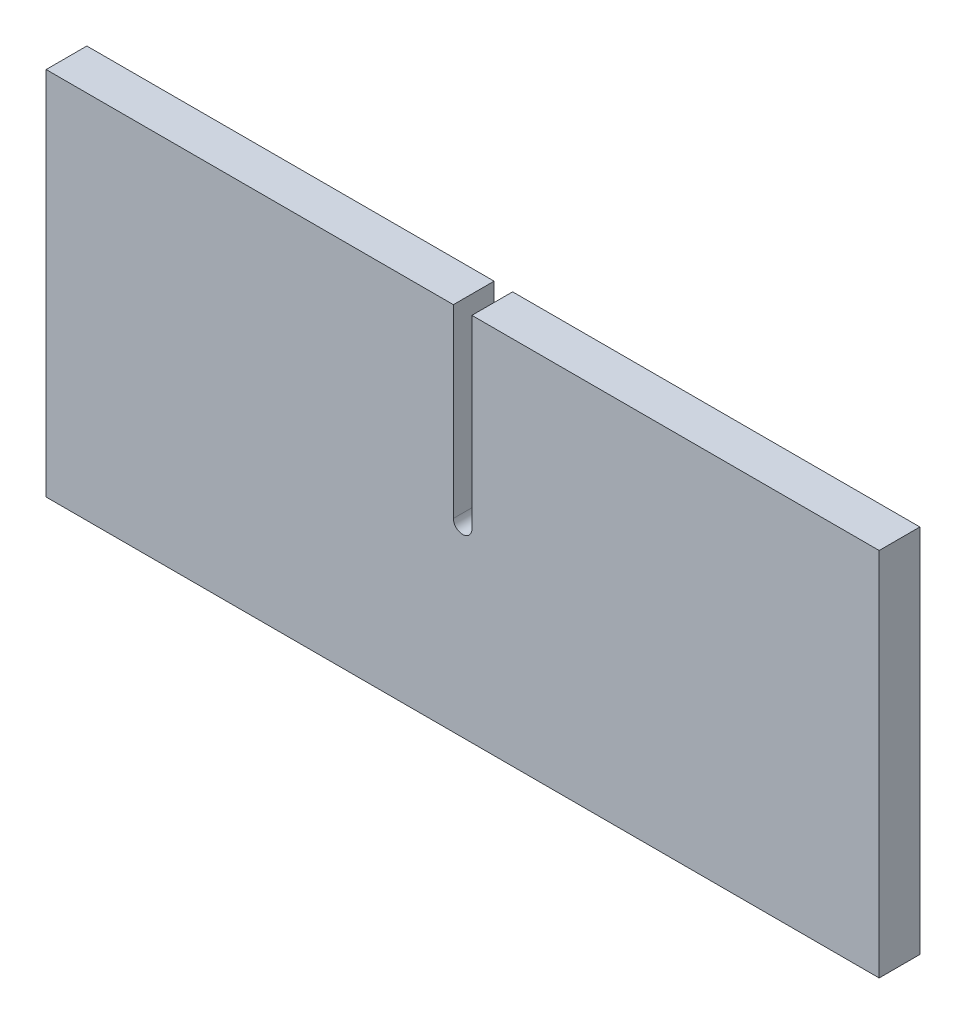
ISO-10303-21;
HEADER;
FILE_DESCRIPTION(('STEP AP214'),'2;1');
FILE_NAME('part.step','',(''),(''),'','','');
FILE_SCHEMA(('AUTOMOTIVE_DESIGN { 1 0 10303 214 1 1 1 1 }'));
ENDSEC;
DATA;
#1=APPLICATION_CONTEXT('core data for automotive mechanical design processes');
#2=APPLICATION_PROTOCOL_DEFINITION('international standard','automotive_design',2000,#1);
#3=PRODUCT_CONTEXT('',#1,'mechanical');
#4=PRODUCT('Part','Part','',(#3));
#5=PRODUCT_RELATED_PRODUCT_CATEGORY('part','',(#4));
#6=PRODUCT_DEFINITION_FORMATION('','',#4);
#7=PRODUCT_DEFINITION_CONTEXT('part definition',#1,'design');
#8=PRODUCT_DEFINITION('design','',#6,#7);
#9=PRODUCT_DEFINITION_SHAPE('','',#8);
#10=(LENGTH_UNIT() NAMED_UNIT(*) SI_UNIT(.MILLI.,.METRE.));
#11=(NAMED_UNIT(*) PLANE_ANGLE_UNIT() SI_UNIT($,.RADIAN.));
#12=(NAMED_UNIT(*) SI_UNIT($,.STERADIAN.) SOLID_ANGLE_UNIT());
#13=UNCERTAINTY_MEASURE_WITH_UNIT(LENGTH_MEASURE(1.E-05),#10,'distance_accuracy_value','');
#14=(GEOMETRIC_REPRESENTATION_CONTEXT(3) GLOBAL_UNCERTAINTY_ASSIGNED_CONTEXT((#13)) GLOBAL_UNIT_ASSIGNED_CONTEXT((#10,
#11,#12)) REPRESENTATION_CONTEXT('',''));
#15=CARTESIAN_POINT('',(0.,0.,0.));
#16=DIRECTION('',(0.,0.,1.));
#17=DIRECTION('',(1.,0.,0.));
#18=AXIS2_PLACEMENT_3D('',#15,#16,#17);
#19=CARTESIAN_POINT('',(-225.,-100.,22.));
#20=DIRECTION('',(1.,0.,0.));
#21=DIRECTION('',(0.,0.,-1.));
#22=AXIS2_PLACEMENT_3D('',#19,#20,#21);
#23=PLANE('',#22);
#24=DIRECTION('',(0.,-1.,0.));
#25=VECTOR('',#24,1.);
#26=CARTESIAN_POINT('',(-225.,-100.,0.));
#27=LINE('',#26,#25);
#28=CARTESIAN_POINT('',(-225.,100.,0.));
#29=VERTEX_POINT('',#28);
#30=CARTESIAN_POINT('',(-225.,-100.,0.));
#31=VERTEX_POINT('',#30);
#32=EDGE_CURVE('E128',#29,#31,#27,.T.);
#33=ORIENTED_EDGE('',*,*,#32,.T.);
#34=DIRECTION('',(0.,0.,-1.));
#35=VECTOR('',#34,1.);
#36=CARTESIAN_POINT('',(-225.,-100.,22.));
#37=LINE('',#36,#35);
#38=CARTESIAN_POINT('',(-225.,-100.,22.));
#39=VERTEX_POINT('',#38);
#40=EDGE_CURVE('E11',#39,#31,#37,.T.);
#41=ORIENTED_EDGE('',*,*,#40,.F.);
#42=DIRECTION('',(0.,-1.,0.));
#43=VECTOR('',#42,1.);
#44=CARTESIAN_POINT('',(-225.,-100.,22.));
#45=LINE('',#44,#43);
#46=CARTESIAN_POINT('',(-225.,100.,22.));
#47=VERTEX_POINT('',#46);
#48=EDGE_CURVE('E142',#47,#39,#45,.T.);
#49=ORIENTED_EDGE('',*,*,#48,.F.);
#50=DIRECTION('',(0.,0.,-1.));
#51=VECTOR('',#50,1.);
#52=CARTESIAN_POINT('',(-225.,100.,22.));
#53=LINE('',#52,#51);
#54=EDGE_CURVE('E124',#47,#29,#53,.T.);
#55=ORIENTED_EDGE('',*,*,#54,.T.);
#56=EDGE_LOOP('',(#33,#41,#49,#55));
#57=FACE_BOUND('',#56,.T.);
#58=ADVANCED_FACE('F32',(#57),#23,.F.);
#59=CARTESIAN_POINT('',(225.,-100.,22.));
#60=DIRECTION('',(0.,1.,0.));
#61=DIRECTION('',(-1.,0.,0.));
#62=AXIS2_PLACEMENT_3D('',#59,#60,#61);
#63=PLANE('',#62);
#64=DIRECTION('',(1.,0.,0.));
#65=VECTOR('',#64,1.);
#66=CARTESIAN_POINT('',(225.,-100.,0.));
#67=LINE('',#66,#65);
#68=CARTESIAN_POINT('',(225.,-100.,0.));
#69=VERTEX_POINT('',#68);
#70=EDGE_CURVE('E131',#31,#69,#67,.T.);
#71=ORIENTED_EDGE('',*,*,#70,.T.);
#72=DIRECTION('',(0.,0.,-1.));
#73=VECTOR('',#72,1.);
#74=CARTESIAN_POINT('',(225.,-100.,22.));
#75=LINE('',#74,#73);
#76=CARTESIAN_POINT('',(225.,-100.,22.));
#77=VERTEX_POINT('',#76);
#78=EDGE_CURVE('E40',#77,#69,#75,.T.);
#79=ORIENTED_EDGE('',*,*,#78,.F.);
#80=DIRECTION('',(1.,0.,0.));
#81=VECTOR('',#80,1.);
#82=CARTESIAN_POINT('',(225.,-100.,22.));
#83=LINE('',#82,#81);
#84=EDGE_CURVE('E91',#39,#77,#83,.T.);
#85=ORIENTED_EDGE('',*,*,#84,.F.);
#86=ORIENTED_EDGE('',*,*,#40,.T.);
#87=EDGE_LOOP('',(#71,#79,#85,#86));
#88=FACE_BOUND('',#87,.T.);
#89=ADVANCED_FACE('F177',(#88),#63,.F.);
#90=CARTESIAN_POINT('',(225.,-100.,22.));
#91=DIRECTION('',(-1.,0.,0.));
#92=DIRECTION('',(0.,0.,1.));
#93=AXIS2_PLACEMENT_3D('',#90,#91,#92);
#94=PLANE('',#93);
#95=DIRECTION('',(0.,1.,0.));
#96=VECTOR('',#95,1.);
#97=CARTESIAN_POINT('',(225.,-100.,0.));
#98=LINE('',#97,#96);
#99=CARTESIAN_POINT('',(225.,100.,0.));
#100=VERTEX_POINT('',#99);
#101=EDGE_CURVE('E133',#69,#100,#98,.T.);
#102=ORIENTED_EDGE('',*,*,#101,.T.);
#103=DIRECTION('',(0.,0.,-1.));
#104=VECTOR('',#103,1.);
#105=CARTESIAN_POINT('',(225.,100.,22.));
#106=LINE('',#105,#104);
#107=CARTESIAN_POINT('',(225.,100.,22.));
#108=VERTEX_POINT('',#107);
#109=EDGE_CURVE('E149',#108,#100,#106,.T.);
#110=ORIENTED_EDGE('',*,*,#109,.F.);
#111=DIRECTION('',(0.,1.,0.));
#112=VECTOR('',#111,1.);
#113=CARTESIAN_POINT('',(225.,-100.,22.));
#114=LINE('',#113,#112);
#115=EDGE_CURVE('E157',#77,#108,#114,.T.);
#116=ORIENTED_EDGE('',*,*,#115,.F.);
#117=ORIENTED_EDGE('',*,*,#78,.T.);
#118=EDGE_LOOP('',(#102,#110,#116,#117));
#119=FACE_BOUND('',#118,.T.);
#120=ADVANCED_FACE('F155',(#119),#94,.F.);
#121=CARTESIAN_POINT('',(225.,100.,22.));
#122=DIRECTION('',(0.,-1.,0.));
#123=DIRECTION('',(1.,0.,0.));
#124=AXIS2_PLACEMENT_3D('',#121,#122,#123);
#125=PLANE('',#124);
#126=DIRECTION('',(-1.,0.,0.));
#127=VECTOR('',#126,1.);
#128=CARTESIAN_POINT('',(225.,100.,0.));
#129=LINE('',#128,#127);
#130=CARTESIAN_POINT('',(5.00000000000006,100.,0.));
#131=VERTEX_POINT('',#130);
#132=EDGE_CURVE('E135',#100,#131,#129,.T.);
#133=ORIENTED_EDGE('',*,*,#132,.T.);
#134=DIRECTION('',(0.,0.,-1.));
#135=VECTOR('',#134,1.);
#136=CARTESIAN_POINT('',(5.00000000000006,100.,22.));
#137=LINE('',#136,#135);
#138=CARTESIAN_POINT('',(5.00000000000006,100.,22.));
#139=VERTEX_POINT('',#138);
#140=EDGE_CURVE('E146',#139,#131,#137,.T.);
#141=ORIENTED_EDGE('',*,*,#140,.F.);
#142=DIRECTION('',(-1.,0.,0.));
#143=VECTOR('',#142,1.);
#144=CARTESIAN_POINT('',(225.,100.,22.));
#145=LINE('',#144,#143);
#146=EDGE_CURVE('E169',#108,#139,#145,.T.);
#147=ORIENTED_EDGE('',*,*,#146,.F.);
#148=ORIENTED_EDGE('',*,*,#109,.T.);
#149=EDGE_LOOP('',(#133,#141,#147,#148));
#150=FACE_BOUND('',#149,.T.);
#151=ADVANCED_FACE('F165',(#150),#125,.F.);
#152=CARTESIAN_POINT('',(5.00000000000006,100.,22.));
#153=DIRECTION('',(1.,0.,0.));
#154=DIRECTION('',(0.,0.,-1.));
#155=AXIS2_PLACEMENT_3D('',#152,#153,#154);
#156=PLANE('',#155);
#157=DIRECTION('',(0.,-1.,0.));
#158=VECTOR('',#157,1.);
#159=CARTESIAN_POINT('',(5.00000000000006,100.,0.));
#160=LINE('',#159,#158);
#161=CARTESIAN_POINT('',(5.00000000000006,0.,0.));
#162=VERTEX_POINT('',#161);
#163=EDGE_CURVE('E137',#131,#162,#160,.T.);
#164=ORIENTED_EDGE('',*,*,#163,.T.);
#165=DIRECTION('',(0.,0.,-1.));
#166=VECTOR('',#165,1.);
#167=CARTESIAN_POINT('',(5.00000000000006,0.,22.));
#168=LINE('',#167,#166);
#169=CARTESIAN_POINT('',(5.00000000000006,0.,22.));
#170=VERTEX_POINT('',#169);
#171=EDGE_CURVE('E119',#170,#162,#168,.T.);
#172=ORIENTED_EDGE('',*,*,#171,.F.);
#173=DIRECTION('',(0.,-1.,0.));
#174=VECTOR('',#173,1.);
#175=CARTESIAN_POINT('',(5.00000000000006,100.,22.));
#176=LINE('',#175,#174);
#177=EDGE_CURVE('E110',#139,#170,#176,.T.);
#178=ORIENTED_EDGE('',*,*,#177,.F.);
#179=ORIENTED_EDGE('',*,*,#140,.T.);
#180=EDGE_LOOP('',(#164,#172,#178,#179));
#181=FACE_BOUND('',#180,.T.);
#182=ADVANCED_FACE('F168',(#181),#156,.F.);
#183=CARTESIAN_POINT('',(0.,0.,22.));
#184=DIRECTION('',(0.,0.,-1.));
#185=DIRECTION('',(-1.,0.,0.));
#186=AXIS2_PLACEMENT_3D('',#183,#184,#185);
#187=CYLINDRICAL_SURFACE('',#186,5.);
#188=CARTESIAN_POINT('',(0.,0.,0.));
#189=DIRECTION('',(0.,0.,-1.));
#190=DIRECTION('',(1.,0.,0.));
#191=AXIS2_PLACEMENT_3D('',#188,#189,#190);
#192=CIRCLE('',#191,5.);
#193=CARTESIAN_POINT('',(-4.99999999999995,0.,0.));
#194=VERTEX_POINT('',#193);
#195=EDGE_CURVE('E118',#162,#194,#192,.T.);
#196=ORIENTED_EDGE('',*,*,#195,.T.);
#197=DIRECTION('',(0.,0.,-1.));
#198=VECTOR('',#197,1.);
#199=CARTESIAN_POINT('',(-4.99999999999995,0.,22.));
#200=LINE('',#199,#198);
#201=CARTESIAN_POINT('',(-4.99999999999995,0.,22.));
#202=VERTEX_POINT('',#201);
#203=EDGE_CURVE('E115',#202,#194,#200,.T.);
#204=ORIENTED_EDGE('',*,*,#203,.F.);
#205=CARTESIAN_POINT('',(0.,0.,22.));
#206=DIRECTION('',(0.,0.,-1.));
#207=DIRECTION('',(1.,0.,0.));
#208=AXIS2_PLACEMENT_3D('',#205,#206,#207);
#209=CIRCLE('',#208,5.);
#210=EDGE_CURVE('E104',#170,#202,#209,.T.);
#211=ORIENTED_EDGE('',*,*,#210,.F.);
#212=ORIENTED_EDGE('',*,*,#171,.T.);
#213=EDGE_LOOP('',(#196,#204,#211,#212));
#214=FACE_BOUND('',#213,.T.);
#215=ADVANCED_FACE('F116',(#214),#187,.F.);
#216=CARTESIAN_POINT('',(-4.99999999999995,100.,22.));
#217=DIRECTION('',(-1.,0.,0.));
#218=DIRECTION('',(0.,0.,1.));
#219=AXIS2_PLACEMENT_3D('',#216,#217,#218);
#220=PLANE('',#219);
#221=DIRECTION('',(0.,1.,0.));
#222=VECTOR('',#221,1.);
#223=CARTESIAN_POINT('',(-4.99999999999995,100.,0.));
#224=LINE('',#223,#222);
#225=CARTESIAN_POINT('',(-4.99999999999995,100.,0.));
#226=VERTEX_POINT('',#225);
#227=EDGE_CURVE('E77',#194,#226,#224,.T.);
#228=ORIENTED_EDGE('',*,*,#227,.T.);
#229=DIRECTION('',(0.,0.,-1.));
#230=VECTOR('',#229,1.);
#231=CARTESIAN_POINT('',(-4.99999999999995,100.,22.));
#232=LINE('',#231,#230);
#233=CARTESIAN_POINT('',(-4.99999999999995,100.,22.));
#234=VERTEX_POINT('',#233);
#235=EDGE_CURVE('E120',#234,#226,#232,.T.);
#236=ORIENTED_EDGE('',*,*,#235,.F.);
#237=DIRECTION('',(0.,1.,0.));
#238=VECTOR('',#237,1.);
#239=CARTESIAN_POINT('',(-4.99999999999995,100.,22.));
#240=LINE('',#239,#238);
#241=EDGE_CURVE('E108',#202,#234,#240,.T.);
#242=ORIENTED_EDGE('',*,*,#241,.F.);
#243=ORIENTED_EDGE('',*,*,#203,.T.);
#244=EDGE_LOOP('',(#228,#236,#242,#243));
#245=FACE_BOUND('',#244,.T.);
#246=ADVANCED_FACE('F122',(#245),#220,.F.);
#247=CARTESIAN_POINT('',(-225.,100.,22.));
#248=DIRECTION('',(0.,-1.,0.));
#249=DIRECTION('',(0.,0.,-1.));
#250=AXIS2_PLACEMENT_3D('',#247,#248,#249);
#251=PLANE('',#250);
#252=DIRECTION('',(-1.,0.,0.));
#253=VECTOR('',#252,1.);
#254=CARTESIAN_POINT('',(-225.,100.,0.));
#255=LINE('',#254,#253);
#256=EDGE_CURVE('E83',#226,#29,#255,.T.);
#257=ORIENTED_EDGE('',*,*,#256,.T.);
#258=ORIENTED_EDGE('',*,*,#54,.F.);
#259=DIRECTION('',(-1.,0.,0.));
#260=VECTOR('',#259,1.);
#261=CARTESIAN_POINT('',(-225.,100.,22.));
#262=LINE('',#261,#260);
#263=EDGE_CURVE('E48',#234,#47,#262,.T.);
#264=ORIENTED_EDGE('',*,*,#263,.F.);
#265=ORIENTED_EDGE('',*,*,#235,.T.);
#266=EDGE_LOOP('',(#257,#258,#264,#265));
#267=FACE_BOUND('',#266,.T.);
#268=ADVANCED_FACE('F193',(#267),#251,.F.);
#269=CARTESIAN_POINT('',(0.,0.,22.));
#270=DIRECTION('',(0.,0.,1.));
#271=DIRECTION('',(1.,0.,0.));
#272=AXIS2_PLACEMENT_3D('',#269,#270,#271);
#273=PLANE('',#272);
#274=ORIENTED_EDGE('',*,*,#48,.T.);
#275=ORIENTED_EDGE('',*,*,#84,.T.);
#276=ORIENTED_EDGE('',*,*,#115,.T.);
#277=ORIENTED_EDGE('',*,*,#146,.T.);
#278=ORIENTED_EDGE('',*,*,#177,.T.);
#279=ORIENTED_EDGE('',*,*,#210,.T.);
#280=ORIENTED_EDGE('',*,*,#241,.T.);
#281=ORIENTED_EDGE('',*,*,#263,.T.);
#282=EDGE_LOOP('',(#274,#275,#276,#277,#278,#279,#280,#281));
#283=FACE_BOUND('',#282,.T.);
#284=ADVANCED_FACE('F106',(#283),#273,.T.);
#285=CARTESIAN_POINT('',(0.,0.,0.));
#286=DIRECTION('',(0.,0.,1.));
#287=DIRECTION('',(1.,0.,0.));
#288=AXIS2_PLACEMENT_3D('',#285,#286,#287);
#289=PLANE('',#288);
#290=ORIENTED_EDGE('',*,*,#32,.F.);
#291=ORIENTED_EDGE('',*,*,#256,.F.);
#292=ORIENTED_EDGE('',*,*,#227,.F.);
#293=ORIENTED_EDGE('',*,*,#195,.F.);
#294=ORIENTED_EDGE('',*,*,#163,.F.);
#295=ORIENTED_EDGE('',*,*,#132,.F.);
#296=ORIENTED_EDGE('',*,*,#101,.F.);
#297=ORIENTED_EDGE('',*,*,#70,.F.);
#298=EDGE_LOOP('',(#290,#291,#292,#293,#294,#295,#296,#297));
#299=FACE_BOUND('',#298,.T.);
#300=ADVANCED_FACE('F161',(#299),#289,.F.);
#301=CLOSED_SHELL('',(#58,#89,#120,#151,#182,#215,#246,#268,#284,#300));
#302=MANIFOLD_SOLID_BREP('B2',#301);
#303=ADVANCED_BREP_SHAPE_REPRESENTATION('',(#18,#302),#14);
#304=SHAPE_DEFINITION_REPRESENTATION(#9,#303);
ENDSEC;
END-ISO-10303-21;
